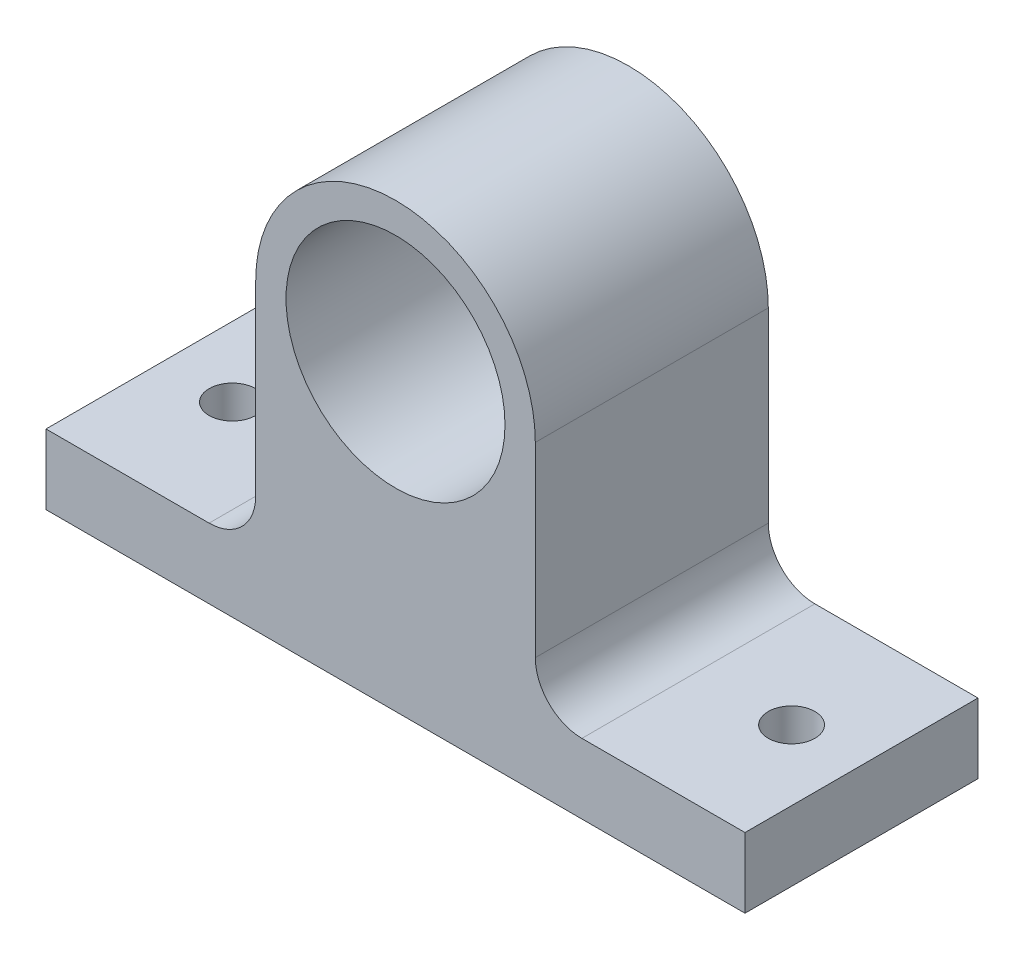
ISO-10303-21;
HEADER;
FILE_DESCRIPTION(('STEP AP214'),'2;1');
FILE_NAME('part.step','',(''),(''),'','','');
FILE_SCHEMA(('AUTOMOTIVE_DESIGN { 1 0 10303 214 1 1 1 1 }'));
ENDSEC;
DATA;
#1=APPLICATION_CONTEXT('core data for automotive mechanical design processes');
#2=APPLICATION_PROTOCOL_DEFINITION('international standard','automotive_design',2000,#1);
#3=PRODUCT_CONTEXT('',#1,'mechanical');
#4=PRODUCT('Part','Part','',(#3));
#5=PRODUCT_RELATED_PRODUCT_CATEGORY('part','',(#4));
#6=PRODUCT_DEFINITION_FORMATION('','',#4);
#7=PRODUCT_DEFINITION_CONTEXT('part definition',#1,'design');
#8=PRODUCT_DEFINITION('design','',#6,#7);
#9=PRODUCT_DEFINITION_SHAPE('','',#8);
#10=(LENGTH_UNIT() NAMED_UNIT(*) SI_UNIT(.MILLI.,.METRE.));
#11=(NAMED_UNIT(*) PLANE_ANGLE_UNIT() SI_UNIT($,.RADIAN.));
#12=(NAMED_UNIT(*) SI_UNIT($,.STERADIAN.) SOLID_ANGLE_UNIT());
#13=UNCERTAINTY_MEASURE_WITH_UNIT(LENGTH_MEASURE(1.E-05),#10,'distance_accuracy_value','');
#14=(GEOMETRIC_REPRESENTATION_CONTEXT(3) GLOBAL_UNCERTAINTY_ASSIGNED_CONTEXT((#13)) GLOBAL_UNIT_ASSIGNED_CONTEXT((#10,
#11,#12)) REPRESENTATION_CONTEXT('',''));
#15=CARTESIAN_POINT('',(0.,0.,0.));
#16=DIRECTION('',(0.,0.,1.));
#17=DIRECTION('',(1.,0.,0.));
#18=AXIS2_PLACEMENT_3D('',#15,#16,#17);
#19=CARTESIAN_POINT('',(0.,57.5,50.));
#20=DIRECTION('',(0.,0.,1.));
#21=DIRECTION('',(1.,0.,0.));
#22=AXIS2_PLACEMENT_3D('',#19,#20,#21);
#23=PLANE('',#22);
#24=DIRECTION('',(0.,-1.,0.));
#25=VECTOR('',#24,1.);
#26=CARTESIAN_POINT('',(-30.,7.5,50.));
#27=LINE('',#26,#25);
#28=CARTESIAN_POINT('',(-30.,57.5,50.));
#29=VERTEX_POINT('',#28);
#30=CARTESIAN_POINT('',(-30.,17.5,50.));
#31=VERTEX_POINT('',#30);
#32=EDGE_CURVE('E247',#29,#31,#27,.T.);
#33=ORIENTED_EDGE('',*,*,#32,.T.);
#34=CARTESIAN_POINT('',(-40.,17.5,50.));
#35=DIRECTION('',(0.,0.,1.));
#36=DIRECTION('',(1.,0.,0.));
#37=AXIS2_PLACEMENT_3D('',#34,#35,#36);
#38=CIRCLE('',#37,10.);
#39=CARTESIAN_POINT('',(-40.,7.5,50.));
#40=VERTEX_POINT('',#39);
#41=EDGE_CURVE('E122',#31,#40,#38,.F.);
#42=ORIENTED_EDGE('',*,*,#41,.T.);
#43=DIRECTION('',(-1.,0.,0.));
#44=VECTOR('',#43,1.);
#45=CARTESIAN_POINT('',(-30.,7.5,50.));
#46=LINE('',#45,#44);
#47=CARTESIAN_POINT('',(-75.,7.49999999999999,50.));
#48=VERTEX_POINT('',#47);
#49=EDGE_CURVE('E117',#40,#48,#46,.T.);
#50=ORIENTED_EDGE('',*,*,#49,.T.);
#51=DIRECTION('',(0.,-1.,0.));
#52=VECTOR('',#51,1.);
#53=CARTESIAN_POINT('',(-75.,-7.50000000000001,50.));
#54=LINE('',#53,#52);
#55=CARTESIAN_POINT('',(-75.,-7.50000000000001,50.));
#56=VERTEX_POINT('',#55);
#57=EDGE_CURVE('E118',#48,#56,#54,.T.);
#58=ORIENTED_EDGE('',*,*,#57,.T.);
#59=DIRECTION('',(1.,0.,0.));
#60=VECTOR('',#59,1.);
#61=CARTESIAN_POINT('',(75.,-7.49999999999999,50.));
#62=LINE('',#61,#60);
#63=CARTESIAN_POINT('',(75.,-7.49999999999999,50.));
#64=VERTEX_POINT('',#63);
#65=EDGE_CURVE('E140',#56,#64,#62,.T.);
#66=ORIENTED_EDGE('',*,*,#65,.T.);
#67=DIRECTION('',(0.,1.,0.));
#68=VECTOR('',#67,1.);
#69=CARTESIAN_POINT('',(75.,-7.49999999999999,50.));
#70=LINE('',#69,#68);
#71=CARTESIAN_POINT('',(75.,7.50000000000001,50.));
#72=VERTEX_POINT('',#71);
#73=EDGE_CURVE('E238',#64,#72,#70,.T.);
#74=ORIENTED_EDGE('',*,*,#73,.T.);
#75=DIRECTION('',(-1.,0.,0.));
#76=VECTOR('',#75,1.);
#77=CARTESIAN_POINT('',(75.,7.50000000000001,50.));
#78=LINE('',#77,#76);
#79=CARTESIAN_POINT('',(40.,7.50000000000001,50.));
#80=VERTEX_POINT('',#79);
#81=EDGE_CURVE('E245',#72,#80,#78,.T.);
#82=ORIENTED_EDGE('',*,*,#81,.T.);
#83=CARTESIAN_POINT('',(40.,17.5,50.));
#84=DIRECTION('',(0.,0.,1.));
#85=DIRECTION('',(1.,0.,0.));
#86=AXIS2_PLACEMENT_3D('',#83,#84,#85);
#87=CIRCLE('',#86,10.);
#88=CARTESIAN_POINT('',(30.,17.5,50.));
#89=VERTEX_POINT('',#88);
#90=EDGE_CURVE('E11',#80,#89,#87,.F.);
#91=ORIENTED_EDGE('',*,*,#90,.T.);
#92=DIRECTION('',(0.,1.,0.));
#93=VECTOR('',#92,1.);
#94=CARTESIAN_POINT('',(30.,57.5,50.));
#95=LINE('',#94,#93);
#96=CARTESIAN_POINT('',(30.,57.5,50.));
#97=VERTEX_POINT('',#96);
#98=EDGE_CURVE('E241',#89,#97,#95,.T.);
#99=ORIENTED_EDGE('',*,*,#98,.T.);
#100=CARTESIAN_POINT('',(0.,57.5,50.));
#101=DIRECTION('',(0.,0.,1.));
#102=DIRECTION('',(1.,0.,0.));
#103=AXIS2_PLACEMENT_3D('',#100,#101,#102);
#104=CIRCLE('',#103,30.);
#105=EDGE_CURVE('E246',#97,#29,#104,.T.);
#106=ORIENTED_EDGE('',*,*,#105,.T.);
#107=EDGE_LOOP('',(#33,#42,#50,#58,#66,#74,#82,#91,#99,#106));
#108=FACE_BOUND('',#107,.T.);
#109=CARTESIAN_POINT('',(0.,57.5,50.));
#110=DIRECTION('',(0.,0.,1.));
#111=DIRECTION('',(1.,0.,0.));
#112=AXIS2_PLACEMENT_3D('',#109,#110,#111);
#113=CIRCLE('',#112,23.5);
#114=CARTESIAN_POINT('',(23.5,57.5,50.));
#115=VERTEX_POINT('',#114);
#116=EDGE_CURVE('E232',#115,#115,#113,.T.);
#117=ORIENTED_EDGE('',*,*,#116,.F.);
#118=EDGE_LOOP('',(#117));
#119=FACE_BOUND('',#118,.T.);
#120=ADVANCED_FACE('F39',(#108,#119),#23,.T.);
#121=CARTESIAN_POINT('',(0.,57.5,0.));
#122=DIRECTION('',(0.,0.,1.));
#123=DIRECTION('',(1.,0.,0.));
#124=AXIS2_PLACEMENT_3D('',#121,#122,#123);
#125=PLANE('',#124);
#126=DIRECTION('',(-1.,0.,0.));
#127=VECTOR('',#126,1.);
#128=CARTESIAN_POINT('',(-30.,7.5,0.));
#129=LINE('',#128,#127);
#130=CARTESIAN_POINT('',(-40.,7.5,0.));
#131=VERTEX_POINT('',#130);
#132=CARTESIAN_POINT('',(-75.,7.49999999999999,0.));
#133=VERTEX_POINT('',#132);
#134=EDGE_CURVE('E143',#131,#133,#129,.T.);
#135=ORIENTED_EDGE('',*,*,#134,.F.);
#136=CARTESIAN_POINT('',(-40.,17.5,0.));
#137=DIRECTION('',(0.,0.,1.));
#138=DIRECTION('',(1.,0.,0.));
#139=AXIS2_PLACEMENT_3D('',#136,#137,#138);
#140=CIRCLE('',#139,10.);
#141=CARTESIAN_POINT('',(-30.,17.5,0.));
#142=VERTEX_POINT('',#141);
#143=EDGE_CURVE('E156',#131,#142,#140,.T.);
#144=ORIENTED_EDGE('',*,*,#143,.T.);
#145=DIRECTION('',(0.,-1.,0.));
#146=VECTOR('',#145,1.);
#147=CARTESIAN_POINT('',(-30.,7.5,0.));
#148=LINE('',#147,#146);
#149=CARTESIAN_POINT('',(-30.,57.5,0.));
#150=VERTEX_POINT('',#149);
#151=EDGE_CURVE('E126',#150,#142,#148,.T.);
#152=ORIENTED_EDGE('',*,*,#151,.F.);
#153=CARTESIAN_POINT('',(0.,57.5,0.));
#154=DIRECTION('',(0.,0.,1.));
#155=DIRECTION('',(1.,0.,0.));
#156=AXIS2_PLACEMENT_3D('',#153,#154,#155);
#157=CIRCLE('',#156,30.);
#158=CARTESIAN_POINT('',(30.,57.5,0.));
#159=VERTEX_POINT('',#158);
#160=EDGE_CURVE('E175',#159,#150,#157,.T.);
#161=ORIENTED_EDGE('',*,*,#160,.F.);
#162=DIRECTION('',(0.,1.,0.));
#163=VECTOR('',#162,1.);
#164=CARTESIAN_POINT('',(30.,57.5,0.));
#165=LINE('',#164,#163);
#166=CARTESIAN_POINT('',(30.,17.5,0.));
#167=VERTEX_POINT('',#166);
#168=EDGE_CURVE('E259',#167,#159,#165,.T.);
#169=ORIENTED_EDGE('',*,*,#168,.F.);
#170=CARTESIAN_POINT('',(40.,17.5,0.));
#171=DIRECTION('',(0.,0.,1.));
#172=DIRECTION('',(1.,0.,0.));
#173=AXIS2_PLACEMENT_3D('',#170,#171,#172);
#174=CIRCLE('',#173,10.);
#175=CARTESIAN_POINT('',(40.,7.50000000000001,0.));
#176=VERTEX_POINT('',#175);
#177=EDGE_CURVE('E48',#167,#176,#174,.T.);
#178=ORIENTED_EDGE('',*,*,#177,.T.);
#179=DIRECTION('',(-1.,0.,0.));
#180=VECTOR('',#179,1.);
#181=CARTESIAN_POINT('',(75.,7.50000000000001,0.));
#182=LINE('',#181,#180);
#183=CARTESIAN_POINT('',(75.,7.50000000000001,0.));
#184=VERTEX_POINT('',#183);
#185=EDGE_CURVE('E260',#184,#176,#182,.T.);
#186=ORIENTED_EDGE('',*,*,#185,.F.);
#187=DIRECTION('',(0.,1.,0.));
#188=VECTOR('',#187,1.);
#189=CARTESIAN_POINT('',(75.,-7.49999999999999,0.));
#190=LINE('',#189,#188);
#191=CARTESIAN_POINT('',(75.,-7.49999999999999,0.));
#192=VERTEX_POINT('',#191);
#193=EDGE_CURVE('E254',#192,#184,#190,.T.);
#194=ORIENTED_EDGE('',*,*,#193,.F.);
#195=DIRECTION('',(1.,0.,0.));
#196=VECTOR('',#195,1.);
#197=CARTESIAN_POINT('',(75.,-7.49999999999999,0.));
#198=LINE('',#197,#196);
#199=CARTESIAN_POINT('',(-75.,-7.50000000000001,0.));
#200=VERTEX_POINT('',#199);
#201=EDGE_CURVE('E251',#200,#192,#198,.T.);
#202=ORIENTED_EDGE('',*,*,#201,.F.);
#203=DIRECTION('',(0.,-1.,0.));
#204=VECTOR('',#203,1.);
#205=CARTESIAN_POINT('',(-75.,-7.50000000000001,0.));
#206=LINE('',#205,#204);
#207=EDGE_CURVE('E253',#133,#200,#206,.T.);
#208=ORIENTED_EDGE('',*,*,#207,.F.);
#209=EDGE_LOOP('',(#135,#144,#152,#161,#169,#178,#186,#194,#202,#208));
#210=FACE_BOUND('',#209,.T.);
#211=CARTESIAN_POINT('',(0.,57.5,0.));
#212=DIRECTION('',(0.,0.,1.));
#213=DIRECTION('',(1.,0.,0.));
#214=AXIS2_PLACEMENT_3D('',#211,#212,#213);
#215=CIRCLE('',#214,23.5);
#216=CARTESIAN_POINT('',(23.5,57.5,0.));
#217=VERTEX_POINT('',#216);
#218=EDGE_CURVE('E237',#217,#217,#215,.T.);
#219=ORIENTED_EDGE('',*,*,#218,.T.);
#220=EDGE_LOOP('',(#219));
#221=FACE_BOUND('',#220,.T.);
#222=ADVANCED_FACE('F161',(#210,#221),#125,.F.);
#223=CARTESIAN_POINT('',(-30.,7.5,50.));
#224=DIRECTION('',(0.,-1.,0.));
#225=DIRECTION('',(1.,0.,0.));
#226=AXIS2_PLACEMENT_3D('',#223,#224,#225);
#227=PLANE('',#226);
#228=CARTESIAN_POINT('',(-60.,7.49999999999999,25.));
#229=DIRECTION('',(0.,1.,0.));
#230=DIRECTION('',(-1.,0.,0.));
#231=AXIS2_PLACEMENT_3D('',#228,#229,#230);
#232=CIRCLE('',#231,5.);
#233=CARTESIAN_POINT('',(-65.,7.49999999999999,25.));
#234=VERTEX_POINT('',#233);
#235=EDGE_CURVE('E224',#234,#234,#232,.T.);
#236=ORIENTED_EDGE('',*,*,#235,.F.);
#237=EDGE_LOOP('',(#236));
#238=FACE_BOUND('',#237,.T.);
#239=ORIENTED_EDGE('',*,*,#49,.F.);
#240=DIRECTION('',(0.,0.,-1.));
#241=VECTOR('',#240,1.);
#242=CARTESIAN_POINT('',(-40.,7.5,0.));
#243=LINE('',#242,#241);
#244=EDGE_CURVE('E141',#40,#131,#243,.T.);
#245=ORIENTED_EDGE('',*,*,#244,.T.);
#246=ORIENTED_EDGE('',*,*,#134,.T.);
#247=DIRECTION('',(0.,0.,-1.));
#248=VECTOR('',#247,1.);
#249=CARTESIAN_POINT('',(-75.,7.49999999999999,50.));
#250=LINE('',#249,#248);
#251=EDGE_CURVE('E134',#48,#133,#250,.T.);
#252=ORIENTED_EDGE('',*,*,#251,.F.);
#253=EDGE_LOOP('',(#239,#245,#246,#252));
#254=FACE_BOUND('',#253,.T.);
#255=ADVANCED_FACE('F138',(#238,#254),#227,.F.);
#256=CARTESIAN_POINT('',(-75.,-7.50000000000001,50.));
#257=DIRECTION('',(1.,0.,0.));
#258=DIRECTION('',(0.,0.,-1.));
#259=AXIS2_PLACEMENT_3D('',#256,#257,#258);
#260=PLANE('',#259);
#261=ORIENTED_EDGE('',*,*,#207,.T.);
#262=DIRECTION('',(0.,0.,-1.));
#263=VECTOR('',#262,1.);
#264=CARTESIAN_POINT('',(-75.,-7.50000000000001,50.));
#265=LINE('',#264,#263);
#266=EDGE_CURVE('E133',#56,#200,#265,.T.);
#267=ORIENTED_EDGE('',*,*,#266,.F.);
#268=ORIENTED_EDGE('',*,*,#57,.F.);
#269=ORIENTED_EDGE('',*,*,#251,.T.);
#270=EDGE_LOOP('',(#261,#267,#268,#269));
#271=FACE_BOUND('',#270,.T.);
#272=ADVANCED_FACE('F135',(#271),#260,.F.);
#273=CARTESIAN_POINT('',(75.,-7.49999999999999,50.));
#274=DIRECTION('',(0.,1.,0.));
#275=DIRECTION('',(-1.,0.,0.));
#276=AXIS2_PLACEMENT_3D('',#273,#274,#275);
#277=PLANE('',#276);
#278=CARTESIAN_POINT('',(-60.,-7.50000000000001,25.));
#279=DIRECTION('',(0.,1.,0.));
#280=DIRECTION('',(-1.,0.,0.));
#281=AXIS2_PLACEMENT_3D('',#278,#279,#280);
#282=CIRCLE('',#281,5.);
#283=CARTESIAN_POINT('',(-65.,-7.50000000000001,25.));
#284=VERTEX_POINT('',#283);
#285=EDGE_CURVE('E43',#284,#284,#282,.T.);
#286=ORIENTED_EDGE('',*,*,#285,.T.);
#287=EDGE_LOOP('',(#286));
#288=FACE_BOUND('',#287,.T.);
#289=CARTESIAN_POINT('',(60.,-7.49999999999999,25.));
#290=DIRECTION('',(0.,1.,0.));
#291=DIRECTION('',(-1.,0.,0.));
#292=AXIS2_PLACEMENT_3D('',#289,#290,#291);
#293=CIRCLE('',#292,5.);
#294=CARTESIAN_POINT('',(55.,-7.49999999999999,25.));
#295=VERTEX_POINT('',#294);
#296=EDGE_CURVE('E223',#295,#295,#293,.T.);
#297=ORIENTED_EDGE('',*,*,#296,.T.);
#298=EDGE_LOOP('',(#297));
#299=FACE_BOUND('',#298,.T.);
#300=ORIENTED_EDGE('',*,*,#201,.T.);
#301=DIRECTION('',(0.,0.,-1.));
#302=VECTOR('',#301,1.);
#303=CARTESIAN_POINT('',(75.,-7.49999999999999,50.));
#304=LINE('',#303,#302);
#305=EDGE_CURVE('E150',#64,#192,#304,.T.);
#306=ORIENTED_EDGE('',*,*,#305,.F.);
#307=ORIENTED_EDGE('',*,*,#65,.F.);
#308=ORIENTED_EDGE('',*,*,#266,.T.);
#309=EDGE_LOOP('',(#300,#306,#307,#308));
#310=FACE_BOUND('',#309,.T.);
#311=ADVANCED_FACE('F211',(#288,#299,#310),#277,.F.);
#312=CARTESIAN_POINT('',(75.,-7.49999999999999,50.));
#313=DIRECTION('',(-1.,0.,0.));
#314=DIRECTION('',(0.,0.,1.));
#315=AXIS2_PLACEMENT_3D('',#312,#313,#314);
#316=PLANE('',#315);
#317=ORIENTED_EDGE('',*,*,#193,.T.);
#318=DIRECTION('',(0.,0.,-1.));
#319=VECTOR('',#318,1.);
#320=CARTESIAN_POINT('',(75.,7.50000000000001,50.));
#321=LINE('',#320,#319);
#322=EDGE_CURVE('E266',#72,#184,#321,.T.);
#323=ORIENTED_EDGE('',*,*,#322,.F.);
#324=ORIENTED_EDGE('',*,*,#73,.F.);
#325=ORIENTED_EDGE('',*,*,#305,.T.);
#326=EDGE_LOOP('',(#317,#323,#324,#325));
#327=FACE_BOUND('',#326,.T.);
#328=ADVANCED_FACE('F210',(#327),#316,.F.);
#329=CARTESIAN_POINT('',(75.,7.50000000000001,50.));
#330=DIRECTION('',(0.,-1.,0.));
#331=DIRECTION('',(1.,0.,0.));
#332=AXIS2_PLACEMENT_3D('',#329,#330,#331);
#333=PLANE('',#332);
#334=CARTESIAN_POINT('',(60.,7.50000000000001,25.));
#335=DIRECTION('',(0.,1.,0.));
#336=DIRECTION('',(1.,0.,0.));
#337=AXIS2_PLACEMENT_3D('',#334,#335,#336);
#338=CIRCLE('',#337,5.);
#339=CARTESIAN_POINT('',(65.,7.50000000000001,25.));
#340=VERTEX_POINT('',#339);
#341=EDGE_CURVE('E227',#340,#340,#338,.T.);
#342=ORIENTED_EDGE('',*,*,#341,.F.);
#343=EDGE_LOOP('',(#342));
#344=FACE_BOUND('',#343,.T.);
#345=ORIENTED_EDGE('',*,*,#185,.T.);
#346=DIRECTION('',(0.,0.,-1.));
#347=VECTOR('',#346,1.);
#348=CARTESIAN_POINT('',(40.,7.50000000000001,50.));
#349=LINE('',#348,#347);
#350=EDGE_CURVE('E54',#176,#80,#349,.F.);
#351=ORIENTED_EDGE('',*,*,#350,.T.);
#352=ORIENTED_EDGE('',*,*,#81,.F.);
#353=ORIENTED_EDGE('',*,*,#322,.T.);
#354=EDGE_LOOP('',(#345,#351,#352,#353));
#355=FACE_BOUND('',#354,.T.);
#356=ADVANCED_FACE('F201',(#344,#355),#333,.F.);
#357=CARTESIAN_POINT('',(30.,57.5,50.));
#358=DIRECTION('',(-1.,0.,0.));
#359=DIRECTION('',(0.,-1.,0.));
#360=AXIS2_PLACEMENT_3D('',#357,#358,#359);
#361=PLANE('',#360);
#362=ORIENTED_EDGE('',*,*,#98,.F.);
#363=DIRECTION('',(0.,0.,-1.));
#364=VECTOR('',#363,1.);
#365=CARTESIAN_POINT('',(30.,17.5,0.));
#366=LINE('',#365,#364);
#367=EDGE_CURVE('E155',#89,#167,#366,.T.);
#368=ORIENTED_EDGE('',*,*,#367,.T.);
#369=ORIENTED_EDGE('',*,*,#168,.T.);
#370=DIRECTION('',(0.,0.,-1.));
#371=VECTOR('',#370,1.);
#372=CARTESIAN_POINT('',(30.,57.5,50.));
#373=LINE('',#372,#371);
#374=EDGE_CURVE('E263',#97,#159,#373,.T.);
#375=ORIENTED_EDGE('',*,*,#374,.F.);
#376=EDGE_LOOP('',(#362,#368,#369,#375));
#377=FACE_BOUND('',#376,.T.);
#378=ADVANCED_FACE('F200',(#377),#361,.F.);
#379=CARTESIAN_POINT('',(0.,57.5,50.));
#380=DIRECTION('',(0.,0.,-1.));
#381=DIRECTION('',(-1.,0.,0.));
#382=AXIS2_PLACEMENT_3D('',#379,#380,#381);
#383=CYLINDRICAL_SURFACE('',#382,30.);
#384=ORIENTED_EDGE('',*,*,#160,.T.);
#385=DIRECTION('',(0.,0.,-1.));
#386=VECTOR('',#385,1.);
#387=CARTESIAN_POINT('',(-30.,57.5,50.));
#388=LINE('',#387,#386);
#389=EDGE_CURVE('E172',#29,#150,#388,.T.);
#390=ORIENTED_EDGE('',*,*,#389,.F.);
#391=ORIENTED_EDGE('',*,*,#105,.F.);
#392=ORIENTED_EDGE('',*,*,#374,.T.);
#393=EDGE_LOOP('',(#384,#390,#391,#392));
#394=FACE_BOUND('',#393,.T.);
#395=ADVANCED_FACE('F198',(#394),#383,.T.);
#396=CARTESIAN_POINT('',(-30.,7.5,50.));
#397=DIRECTION('',(1.,0.,0.));
#398=DIRECTION('',(0.,0.,-1.));
#399=AXIS2_PLACEMENT_3D('',#396,#397,#398);
#400=PLANE('',#399);
#401=ORIENTED_EDGE('',*,*,#151,.T.);
#402=DIRECTION('',(0.,0.,-1.));
#403=VECTOR('',#402,1.);
#404=CARTESIAN_POINT('',(-30.,17.5,50.));
#405=LINE('',#404,#403);
#406=EDGE_CURVE('E144',#142,#31,#405,.F.);
#407=ORIENTED_EDGE('',*,*,#406,.T.);
#408=ORIENTED_EDGE('',*,*,#32,.F.);
#409=ORIENTED_EDGE('',*,*,#389,.T.);
#410=EDGE_LOOP('',(#401,#407,#408,#409));
#411=FACE_BOUND('',#410,.T.);
#412=ADVANCED_FACE('F169',(#411),#400,.F.);
#413=CARTESIAN_POINT('',(0.,57.5,50.));
#414=DIRECTION('',(0.,0.,-1.));
#415=DIRECTION('',(-1.,0.,0.));
#416=AXIS2_PLACEMENT_3D('',#413,#414,#415);
#417=CYLINDRICAL_SURFACE('',#416,23.5);
#418=ORIENTED_EDGE('',*,*,#116,.T.);
#419=EDGE_LOOP('',(#418));
#420=FACE_BOUND('',#419,.T.);
#421=ORIENTED_EDGE('',*,*,#218,.F.);
#422=EDGE_LOOP('',(#421));
#423=FACE_BOUND('',#422,.T.);
#424=ADVANCED_FACE('F176',(#420,#423),#417,.F.);
#425=CARTESIAN_POINT('',(-40.,17.5,50.));
#426=DIRECTION('',(0.,0.,1.));
#427=DIRECTION('',(1.,0.,0.));
#428=AXIS2_PLACEMENT_3D('',#425,#426,#427);
#429=CYLINDRICAL_SURFACE('',#428,10.);
#430=ORIENTED_EDGE('',*,*,#41,.F.);
#431=ORIENTED_EDGE('',*,*,#406,.F.);
#432=ORIENTED_EDGE('',*,*,#143,.F.);
#433=ORIENTED_EDGE('',*,*,#244,.F.);
#434=EDGE_LOOP('',(#430,#431,#432,#433));
#435=FACE_BOUND('',#434,.T.);
#436=ADVANCED_FACE('F171',(#435),#429,.F.);
#437=CARTESIAN_POINT('',(40.,17.5,50.));
#438=DIRECTION('',(0.,0.,1.));
#439=DIRECTION('',(1.,0.,0.));
#440=AXIS2_PLACEMENT_3D('',#437,#438,#439);
#441=CYLINDRICAL_SURFACE('',#440,10.);
#442=ORIENTED_EDGE('',*,*,#90,.F.);
#443=ORIENTED_EDGE('',*,*,#350,.F.);
#444=ORIENTED_EDGE('',*,*,#177,.F.);
#445=ORIENTED_EDGE('',*,*,#367,.F.);
#446=EDGE_LOOP('',(#442,#443,#444,#445));
#447=FACE_BOUND('',#446,.T.);
#448=ADVANCED_FACE('F41',(#447),#441,.F.);
#449=CARTESIAN_POINT('',(60.,-42.5,25.));
#450=DIRECTION('',(0.,1.,0.));
#451=DIRECTION('',(-1.,0.,0.));
#452=AXIS2_PLACEMENT_3D('',#449,#450,#451);
#453=CYLINDRICAL_SURFACE('',#452,5.);
#454=ORIENTED_EDGE('',*,*,#341,.T.);
#455=EDGE_LOOP('',(#454));
#456=FACE_BOUND('',#455,.T.);
#457=ORIENTED_EDGE('',*,*,#296,.F.);
#458=EDGE_LOOP('',(#457));
#459=FACE_BOUND('',#458,.T.);
#460=ADVANCED_FACE('F182',(#456,#459),#453,.F.);
#461=CARTESIAN_POINT('',(-60.,-42.5,25.));
#462=DIRECTION('',(0.,1.,0.));
#463=DIRECTION('',(-1.,0.,0.));
#464=AXIS2_PLACEMENT_3D('',#461,#462,#463);
#465=CYLINDRICAL_SURFACE('',#464,5.);
#466=ORIENTED_EDGE('',*,*,#235,.T.);
#467=EDGE_LOOP('',(#466));
#468=FACE_BOUND('',#467,.T.);
#469=ORIENTED_EDGE('',*,*,#285,.F.);
#470=EDGE_LOOP('',(#469));
#471=FACE_BOUND('',#470,.T.);
#472=ADVANCED_FACE('F283',(#468,#471),#465,.F.);
#473=CLOSED_SHELL('',(#120,#222,#255,#272,#311,#328,#356,#378,#395,#412,#424,#436,#448,#460,#472));
#474=MANIFOLD_SOLID_BREP('B2',#473);
#475=ADVANCED_BREP_SHAPE_REPRESENTATION('',(#18,#474),#14);
#476=SHAPE_DEFINITION_REPRESENTATION(#9,#475);
ENDSEC;
END-ISO-10303-21;
